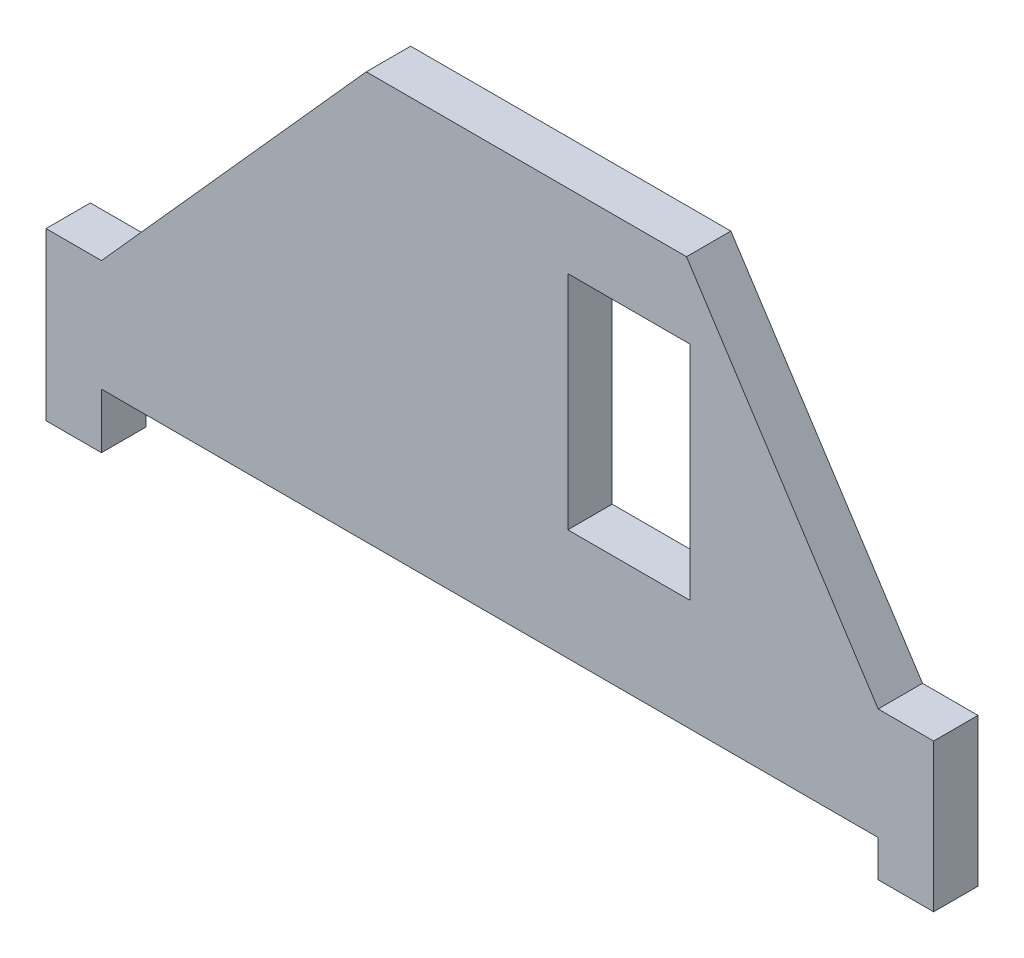
ISO-10303-21;
HEADER;
FILE_DESCRIPTION(('STEP AP214'),'2;1');
FILE_NAME('part.step','',(''),(''),'','','');
FILE_SCHEMA(('AUTOMOTIVE_DESIGN { 1 0 10303 214 1 1 1 1 }'));
ENDSEC;
DATA;
#1=APPLICATION_CONTEXT('core data for automotive mechanical design processes');
#2=APPLICATION_PROTOCOL_DEFINITION('international standard','automotive_design',2000,#1);
#3=PRODUCT_CONTEXT('',#1,'mechanical');
#4=PRODUCT('Part','Part','',(#3));
#5=PRODUCT_RELATED_PRODUCT_CATEGORY('part','',(#4));
#6=PRODUCT_DEFINITION_FORMATION('','',#4);
#7=PRODUCT_DEFINITION_CONTEXT('part definition',#1,'design');
#8=PRODUCT_DEFINITION('design','',#6,#7);
#9=PRODUCT_DEFINITION_SHAPE('','',#8);
#10=(LENGTH_UNIT() NAMED_UNIT(*) SI_UNIT(.MILLI.,.METRE.));
#11=(NAMED_UNIT(*) PLANE_ANGLE_UNIT() SI_UNIT($,.RADIAN.));
#12=(NAMED_UNIT(*) SI_UNIT($,.STERADIAN.) SOLID_ANGLE_UNIT());
#13=UNCERTAINTY_MEASURE_WITH_UNIT(LENGTH_MEASURE(1.E-05),#10,'distance_accuracy_value','');
#14=(GEOMETRIC_REPRESENTATION_CONTEXT(3) GLOBAL_UNCERTAINTY_ASSIGNED_CONTEXT((#13)) GLOBAL_UNIT_ASSIGNED_CONTEXT((#10,
#11,#12)) REPRESENTATION_CONTEXT('',''));
#15=CARTESIAN_POINT('',(0.,0.,0.));
#16=DIRECTION('',(0.,0.,1.));
#17=DIRECTION('',(1.,0.,0.));
#18=AXIS2_PLACEMENT_3D('',#15,#16,#17);
#19=CARTESIAN_POINT('',(65.0718101003511,42.1511119920742,101.6));
#20=DIRECTION('',(-0.839300486720766,-0.543667814929563,0.));
#21=DIRECTION('',(0.543667814929563,-0.839300486720766,0.));
#22=AXIS2_PLACEMENT_3D('',#19,#20,#21);
#23=PLANE('',#22);
#24=DIRECTION('',(-0.543667814929563,0.839300486720766,0.));
#25=VECTOR('',#24,1.);
#26=CARTESIAN_POINT('',(65.0718101003511,42.1511119920742,0.));
#27=LINE('',#26,#25);
#28=CARTESIAN_POINT('',(-127.,338.666666666667,0.));
#29=VERTEX_POINT('',#28);
#30=CARTESIAN_POINT('',(-565.751483096429,1016.,0.));
#31=VERTEX_POINT('',#30);
#32=EDGE_CURVE('E195',#29,#31,#27,.T.);
#33=ORIENTED_EDGE('',*,*,#32,.T.);
#34=DIRECTION('',(0.,0.,-1.));
#35=VECTOR('',#34,1.);
#36=CARTESIAN_POINT('',(-565.751483096429,1016.,101.6));
#37=LINE('',#36,#35);
#38=CARTESIAN_POINT('',(-565.751483096429,1016.,101.6));
#39=VERTEX_POINT('',#38);
#40=EDGE_CURVE('E11',#39,#31,#37,.T.);
#41=ORIENTED_EDGE('',*,*,#40,.F.);
#42=DIRECTION('',(-0.543667814929563,0.839300486720766,0.));
#43=VECTOR('',#42,1.);
#44=CARTESIAN_POINT('',(65.0718101003511,42.1511119920742,101.6));
#45=LINE('',#44,#43);
#46=CARTESIAN_POINT('',(-127.,338.666666666667,101.6));
#47=VERTEX_POINT('',#46);
#48=EDGE_CURVE('E331',#47,#39,#45,.T.);
#49=ORIENTED_EDGE('',*,*,#48,.F.);
#50=DIRECTION('',(0.,0.,-1.));
#51=VECTOR('',#50,1.);
#52=CARTESIAN_POINT('',(-127.,338.666666666667,101.6));
#53=LINE('',#52,#51);
#54=EDGE_CURVE('E53',#47,#29,#53,.T.);
#55=ORIENTED_EDGE('',*,*,#54,.T.);
#56=EDGE_LOOP('',(#33,#41,#49,#55));
#57=FACE_BOUND('',#56,.T.);
#58=ADVANCED_FACE('F34',(#57),#23,.F.);
#59=CARTESIAN_POINT('',(0.,1016.,101.6));
#60=DIRECTION('',(0.,-1.,0.));
#61=DIRECTION('',(0.,0.,-1.));
#62=AXIS2_PLACEMENT_3D('',#59,#60,#61);
#63=PLANE('',#62);
#64=DIRECTION('',(-1.,0.,0.));
#65=VECTOR('',#64,1.);
#66=CARTESIAN_POINT('',(0.,1016.,0.));
#67=LINE('',#66,#65);
#68=CARTESIAN_POINT('',(-1298.87078743548,1016.,0.));
#69=VERTEX_POINT('',#68);
#70=EDGE_CURVE('E197',#31,#69,#67,.T.);
#71=ORIENTED_EDGE('',*,*,#70,.T.);
#72=DIRECTION('',(0.,0.,-1.));
#73=VECTOR('',#72,1.);
#74=CARTESIAN_POINT('',(-1298.87078743548,1016.,101.6));
#75=LINE('',#74,#73);
#76=CARTESIAN_POINT('',(-1298.87078743548,1016.,101.6));
#77=VERTEX_POINT('',#76);
#78=EDGE_CURVE('E44',#77,#69,#75,.T.);
#79=ORIENTED_EDGE('',*,*,#78,.F.);
#80=DIRECTION('',(-1.,0.,0.));
#81=VECTOR('',#80,1.);
#82=CARTESIAN_POINT('',(0.,1016.,101.6));
#83=LINE('',#82,#81);
#84=EDGE_CURVE('E333',#39,#77,#83,.T.);
#85=ORIENTED_EDGE('',*,*,#84,.F.);
#86=ORIENTED_EDGE('',*,*,#40,.T.);
#87=EDGE_LOOP('',(#71,#79,#85,#86));
#88=FACE_BOUND('',#87,.T.);
#89=ADVANCED_FACE('F277',(#88),#63,.F.);
#90=CARTESIAN_POINT('',(-1226.15575619586,1097.25712054791,101.6));
#91=DIRECTION('',(0.745189852710884,-0.666852370031577,0.));
#92=DIRECTION('',(0.666852370031577,0.745189852710884,0.));
#93=AXIS2_PLACEMENT_3D('',#90,#91,#92);
#94=PLANE('',#93);
#95=DIRECTION('',(-0.666852370031577,-0.745189852710884,0.));
#96=VECTOR('',#95,1.);
#97=CARTESIAN_POINT('',(-1226.15575619586,1097.25712054791,0.));
#98=LINE('',#97,#96);
#99=CARTESIAN_POINT('',(-1905.,338.666666666667,0.));
#100=VERTEX_POINT('',#99);
#101=EDGE_CURVE('E199',#69,#100,#98,.T.);
#102=ORIENTED_EDGE('',*,*,#101,.T.);
#103=DIRECTION('',(0.,0.,-1.));
#104=VECTOR('',#103,1.);
#105=CARTESIAN_POINT('',(-1905.,338.666666666667,101.6));
#106=LINE('',#105,#104);
#107=CARTESIAN_POINT('',(-1905.,338.666666666667,101.6));
#108=VERTEX_POINT('',#107);
#109=EDGE_CURVE('E239',#108,#100,#106,.T.);
#110=ORIENTED_EDGE('',*,*,#109,.F.);
#111=DIRECTION('',(-0.666852370031577,-0.745189852710884,0.));
#112=VECTOR('',#111,1.);
#113=CARTESIAN_POINT('',(-1226.15575619586,1097.25712054791,101.6));
#114=LINE('',#113,#112);
#115=EDGE_CURVE('E335',#77,#108,#114,.T.);
#116=ORIENTED_EDGE('',*,*,#115,.F.);
#117=ORIENTED_EDGE('',*,*,#78,.T.);
#118=EDGE_LOOP('',(#102,#110,#116,#117));
#119=FACE_BOUND('',#118,.T.);
#120=ADVANCED_FACE('F282',(#119),#94,.F.);
#121=CARTESIAN_POINT('',(0.,338.666666666667,101.6));
#122=DIRECTION('',(0.,-1.,0.));
#123=DIRECTION('',(0.,0.,-1.));
#124=AXIS2_PLACEMENT_3D('',#121,#122,#123);
#125=PLANE('',#124);
#126=DIRECTION('',(-1.,0.,0.));
#127=VECTOR('',#126,1.);
#128=CARTESIAN_POINT('',(0.,338.666666666667,0.));
#129=LINE('',#128,#127);
#130=CARTESIAN_POINT('',(-2032.,338.666666666667,0.));
#131=VERTEX_POINT('',#130);
#132=EDGE_CURVE('E201',#100,#131,#129,.T.);
#133=ORIENTED_EDGE('',*,*,#132,.T.);
#134=DIRECTION('',(0.,0.,-1.));
#135=VECTOR('',#134,1.);
#136=CARTESIAN_POINT('',(-2032.,338.666666666667,101.6));
#137=LINE('',#136,#135);
#138=CARTESIAN_POINT('',(-2032.,338.666666666667,101.6));
#139=VERTEX_POINT('',#138);
#140=EDGE_CURVE('E237',#139,#131,#137,.T.);
#141=ORIENTED_EDGE('',*,*,#140,.F.);
#142=DIRECTION('',(-1.,0.,0.));
#143=VECTOR('',#142,1.);
#144=CARTESIAN_POINT('',(0.,338.666666666667,101.6));
#145=LINE('',#144,#143);
#146=EDGE_CURVE('E337',#108,#139,#145,.T.);
#147=ORIENTED_EDGE('',*,*,#146,.F.);
#148=ORIENTED_EDGE('',*,*,#109,.T.);
#149=EDGE_LOOP('',(#133,#141,#147,#148));
#150=FACE_BOUND('',#149,.T.);
#151=ADVANCED_FACE('F288',(#150),#125,.F.);
#152=CARTESIAN_POINT('',(-2032.,0.,101.6));
#153=DIRECTION('',(-1.,0.,0.));
#154=DIRECTION('',(0.,0.,1.));
#155=AXIS2_PLACEMENT_3D('',#152,#153,#154);
#156=PLANE('',#155);
#157=DIRECTION('',(0.,1.,0.));
#158=VECTOR('',#157,1.);
#159=CARTESIAN_POINT('',(-2032.,0.,0.));
#160=LINE('',#159,#158);
#161=CARTESIAN_POINT('',(-2032.,-42.3333333333333,0.));
#162=VERTEX_POINT('',#161);
#163=EDGE_CURVE('E204',#162,#131,#160,.T.);
#164=ORIENTED_EDGE('',*,*,#163,.F.);
#165=DIRECTION('',(0.,0.,-1.));
#166=VECTOR('',#165,1.);
#167=CARTESIAN_POINT('',(-2032.,-42.3333333333333,101.6));
#168=LINE('',#167,#166);
#169=CARTESIAN_POINT('',(-2032.,-42.3333333333333,101.6));
#170=VERTEX_POINT('',#169);
#171=EDGE_CURVE('E235',#170,#162,#168,.T.);
#172=ORIENTED_EDGE('',*,*,#171,.F.);
#173=DIRECTION('',(0.,1.,0.));
#174=VECTOR('',#173,1.);
#175=CARTESIAN_POINT('',(-2032.,0.,101.6));
#176=LINE('',#175,#174);
#177=EDGE_CURVE('E339',#170,#139,#176,.T.);
#178=ORIENTED_EDGE('',*,*,#177,.T.);
#179=ORIENTED_EDGE('',*,*,#140,.T.);
#180=EDGE_LOOP('',(#164,#172,#178,#179));
#181=FACE_BOUND('',#180,.T.);
#182=ADVANCED_FACE('F292',(#181),#156,.T.);
#183=CARTESIAN_POINT('',(0.,-42.3333333333333,101.6));
#184=DIRECTION('',(0.,-1.,0.));
#185=DIRECTION('',(0.,0.,-1.));
#186=AXIS2_PLACEMENT_3D('',#183,#184,#185);
#187=PLANE('',#186);
#188=DIRECTION('',(-1.,0.,0.));
#189=VECTOR('',#188,1.);
#190=CARTESIAN_POINT('',(0.,-42.3333333333333,0.));
#191=LINE('',#190,#189);
#192=CARTESIAN_POINT('',(-1905.,-42.3333333333333,0.));
#193=VERTEX_POINT('',#192);
#194=EDGE_CURVE('E207',#193,#162,#191,.T.);
#195=ORIENTED_EDGE('',*,*,#194,.F.);
#196=DIRECTION('',(0.,0.,-1.));
#197=VECTOR('',#196,1.);
#198=CARTESIAN_POINT('',(-1905.,-42.3333333333333,101.6));
#199=LINE('',#198,#197);
#200=CARTESIAN_POINT('',(-1905.,-42.3333333333333,101.6));
#201=VERTEX_POINT('',#200);
#202=EDGE_CURVE('E233',#201,#193,#199,.T.);
#203=ORIENTED_EDGE('',*,*,#202,.F.);
#204=DIRECTION('',(-1.,0.,0.));
#205=VECTOR('',#204,1.);
#206=CARTESIAN_POINT('',(0.,-42.3333333333333,101.6));
#207=LINE('',#206,#205);
#208=EDGE_CURVE('E342',#201,#170,#207,.T.);
#209=ORIENTED_EDGE('',*,*,#208,.T.);
#210=ORIENTED_EDGE('',*,*,#171,.T.);
#211=EDGE_LOOP('',(#195,#203,#209,#210));
#212=FACE_BOUND('',#211,.T.);
#213=ADVANCED_FACE('F296',(#212),#187,.T.);
#214=CARTESIAN_POINT('',(-1905.,0.,101.6));
#215=DIRECTION('',(1.,0.,0.));
#216=DIRECTION('',(0.,0.,-1.));
#217=AXIS2_PLACEMENT_3D('',#214,#215,#216);
#218=PLANE('',#217);
#219=DIRECTION('',(0.,-1.,0.));
#220=VECTOR('',#219,1.);
#221=CARTESIAN_POINT('',(-1905.,0.,0.));
#222=LINE('',#221,#220);
#223=CARTESIAN_POINT('',(-1905.,83.800178309497,0.));
#224=VERTEX_POINT('',#223);
#225=EDGE_CURVE('E210',#224,#193,#222,.T.);
#226=ORIENTED_EDGE('',*,*,#225,.F.);
#227=DIRECTION('',(0.,0.,-1.));
#228=VECTOR('',#227,1.);
#229=CARTESIAN_POINT('',(-1905.,83.800178309497,101.6));
#230=LINE('',#229,#228);
#231=CARTESIAN_POINT('',(-1905.,83.800178309497,101.6));
#232=VERTEX_POINT('',#231);
#233=EDGE_CURVE('E231',#232,#224,#230,.T.);
#234=ORIENTED_EDGE('',*,*,#233,.F.);
#235=DIRECTION('',(0.,-1.,0.));
#236=VECTOR('',#235,1.);
#237=CARTESIAN_POINT('',(-1905.,0.,101.6));
#238=LINE('',#237,#236);
#239=EDGE_CURVE('E345',#232,#201,#238,.T.);
#240=ORIENTED_EDGE('',*,*,#239,.T.);
#241=ORIENTED_EDGE('',*,*,#202,.T.);
#242=EDGE_LOOP('',(#226,#234,#240,#241));
#243=FACE_BOUND('',#242,.T.);
#244=ADVANCED_FACE('F300',(#243),#218,.T.);
#245=CARTESIAN_POINT('',(0.,83.800178309497,101.6));
#246=DIRECTION('',(0.,-1.,0.));
#247=DIRECTION('',(0.,0.,-1.));
#248=AXIS2_PLACEMENT_3D('',#245,#246,#247);
#249=PLANE('',#248);
#250=DIRECTION('',(-1.,0.,0.));
#251=VECTOR('',#250,1.);
#252=CARTESIAN_POINT('',(0.,83.800178309497,0.));
#253=LINE('',#252,#251);
#254=CARTESIAN_POINT('',(-127.,83.800178309497,0.));
#255=VERTEX_POINT('',#254);
#256=EDGE_CURVE('E213',#255,#224,#253,.T.);
#257=ORIENTED_EDGE('',*,*,#256,.F.);
#258=DIRECTION('',(0.,0.,-1.));
#259=VECTOR('',#258,1.);
#260=CARTESIAN_POINT('',(-127.,83.800178309497,101.6));
#261=LINE('',#260,#259);
#262=CARTESIAN_POINT('',(-127.,83.800178309497,101.6));
#263=VERTEX_POINT('',#262);
#264=EDGE_CURVE('E229',#263,#255,#261,.T.);
#265=ORIENTED_EDGE('',*,*,#264,.F.);
#266=DIRECTION('',(-1.,0.,0.));
#267=VECTOR('',#266,1.);
#268=CARTESIAN_POINT('',(0.,83.800178309497,101.6));
#269=LINE('',#268,#267);
#270=EDGE_CURVE('E348',#263,#232,#269,.T.);
#271=ORIENTED_EDGE('',*,*,#270,.T.);
#272=ORIENTED_EDGE('',*,*,#233,.T.);
#273=EDGE_LOOP('',(#257,#265,#271,#272));
#274=FACE_BOUND('',#273,.T.);
#275=ADVANCED_FACE('F304',(#274),#249,.T.);
#276=CARTESIAN_POINT('',(-127.,0.,101.6));
#277=DIRECTION('',(-1.,0.,0.));
#278=DIRECTION('',(0.,0.,1.));
#279=AXIS2_PLACEMENT_3D('',#276,#277,#278);
#280=PLANE('',#279);
#281=DIRECTION('',(0.,1.,0.));
#282=VECTOR('',#281,1.);
#283=CARTESIAN_POINT('',(-127.,0.,0.));
#284=LINE('',#283,#282);
#285=CARTESIAN_POINT('',(-127.,0.,0.));
#286=VERTEX_POINT('',#285);
#287=EDGE_CURVE('E216',#286,#255,#284,.T.);
#288=ORIENTED_EDGE('',*,*,#287,.F.);
#289=DIRECTION('',(0.,0.,-1.));
#290=VECTOR('',#289,1.);
#291=CARTESIAN_POINT('',(-127.,0.,101.6));
#292=LINE('',#291,#290);
#293=CARTESIAN_POINT('',(-127.,0.,101.6));
#294=VERTEX_POINT('',#293);
#295=EDGE_CURVE('E175',#294,#286,#292,.T.);
#296=ORIENTED_EDGE('',*,*,#295,.F.);
#297=DIRECTION('',(0.,1.,0.));
#298=VECTOR('',#297,1.);
#299=CARTESIAN_POINT('',(-127.,0.,101.6));
#300=LINE('',#299,#298);
#301=EDGE_CURVE('E165',#294,#263,#300,.T.);
#302=ORIENTED_EDGE('',*,*,#301,.T.);
#303=ORIENTED_EDGE('',*,*,#264,.T.);
#304=EDGE_LOOP('',(#288,#296,#302,#303));
#305=FACE_BOUND('',#304,.T.);
#306=ADVANCED_FACE('F308',(#305),#280,.T.);
#307=CARTESIAN_POINT('',(0.,0.,101.6));
#308=DIRECTION('',(0.,1.,0.));
#309=DIRECTION('',(0.,0.,1.));
#310=AXIS2_PLACEMENT_3D('',#307,#308,#309);
#311=PLANE('',#310);
#312=DIRECTION('',(1.,0.,0.));
#313=VECTOR('',#312,1.);
#314=CARTESIAN_POINT('',(0.,0.,0.));
#315=LINE('',#314,#313);
#316=CARTESIAN_POINT('',(0.,0.,0.));
#317=VERTEX_POINT('',#316);
#318=EDGE_CURVE('E172',#286,#317,#315,.T.);
#319=ORIENTED_EDGE('',*,*,#318,.T.);
#320=DIRECTION('',(0.,0.,-1.));
#321=VECTOR('',#320,1.);
#322=CARTESIAN_POINT('',(0.,0.,101.6));
#323=LINE('',#322,#321);
#324=CARTESIAN_POINT('',(0.,0.,101.6));
#325=VERTEX_POINT('',#324);
#326=EDGE_CURVE('E169',#325,#317,#323,.T.);
#327=ORIENTED_EDGE('',*,*,#326,.F.);
#328=DIRECTION('',(1.,0.,0.));
#329=VECTOR('',#328,1.);
#330=CARTESIAN_POINT('',(0.,0.,101.6));
#331=LINE('',#330,#329);
#332=EDGE_CURVE('E156',#294,#325,#331,.T.);
#333=ORIENTED_EDGE('',*,*,#332,.F.);
#334=ORIENTED_EDGE('',*,*,#295,.T.);
#335=EDGE_LOOP('',(#319,#327,#333,#334));
#336=FACE_BOUND('',#335,.T.);
#337=ADVANCED_FACE('F170',(#336),#311,.F.);
#338=CARTESIAN_POINT('',(0.,0.,101.6));
#339=DIRECTION('',(-1.,0.,0.));
#340=DIRECTION('',(0.,0.,1.));
#341=AXIS2_PLACEMENT_3D('',#338,#339,#340);
#342=PLANE('',#341);
#343=DIRECTION('',(0.,1.,0.));
#344=VECTOR('',#343,1.);
#345=CARTESIAN_POINT('',(0.,0.,0.));
#346=LINE('',#345,#344);
#347=CARTESIAN_POINT('',(0.,338.666666666667,0.));
#348=VERTEX_POINT('',#347);
#349=EDGE_CURVE('E220',#317,#348,#346,.T.);
#350=ORIENTED_EDGE('',*,*,#349,.T.);
#351=DIRECTION('',(0.,0.,-1.));
#352=VECTOR('',#351,1.);
#353=CARTESIAN_POINT('',(0.,338.666666666667,101.6));
#354=LINE('',#353,#352);
#355=CARTESIAN_POINT('',(0.,338.666666666667,101.6));
#356=VERTEX_POINT('',#355);
#357=EDGE_CURVE('E104',#356,#348,#354,.T.);
#358=ORIENTED_EDGE('',*,*,#357,.F.);
#359=DIRECTION('',(0.,1.,0.));
#360=VECTOR('',#359,1.);
#361=CARTESIAN_POINT('',(0.,0.,101.6));
#362=LINE('',#361,#360);
#363=EDGE_CURVE('E162',#325,#356,#362,.T.);
#364=ORIENTED_EDGE('',*,*,#363,.F.);
#365=ORIENTED_EDGE('',*,*,#326,.T.);
#366=EDGE_LOOP('',(#350,#358,#364,#365));
#367=FACE_BOUND('',#366,.T.);
#368=ADVANCED_FACE('F177',(#367),#342,.F.);
#369=CARTESIAN_POINT('',(-558.038,0.,101.6));
#370=DIRECTION('',(-1.,0.,0.));
#371=DIRECTION('',(0.,0.,1.));
#372=AXIS2_PLACEMENT_3D('',#369,#370,#371);
#373=PLANE('',#372);
#374=DIRECTION('',(0.,1.,0.));
#375=VECTOR('',#374,1.);
#376=CARTESIAN_POINT('',(-558.038,0.,0.));
#377=LINE('',#376,#375);
#378=CARTESIAN_POINT('',(-558.038,338.666666666667,0.));
#379=VERTEX_POINT('',#378);
#380=CARTESIAN_POINT('',(-558.038,846.666666666667,0.));
#381=VERTEX_POINT('',#380);
#382=EDGE_CURVE('E184',#379,#381,#377,.T.);
#383=ORIENTED_EDGE('',*,*,#382,.F.);
#384=DIRECTION('',(0.,0.,-1.));
#385=VECTOR('',#384,1.);
#386=CARTESIAN_POINT('',(-558.038,338.666666666667,101.6));
#387=LINE('',#386,#385);
#388=CARTESIAN_POINT('',(-558.038,338.666666666667,101.6));
#389=VERTEX_POINT('',#388);
#390=EDGE_CURVE('E38',#389,#379,#387,.T.);
#391=ORIENTED_EDGE('',*,*,#390,.F.);
#392=DIRECTION('',(0.,1.,0.));
#393=VECTOR('',#392,1.);
#394=CARTESIAN_POINT('',(-558.038,0.,101.6));
#395=LINE('',#394,#393);
#396=CARTESIAN_POINT('',(-558.038,846.666666666667,101.6));
#397=VERTEX_POINT('',#396);
#398=EDGE_CURVE('E225',#389,#397,#395,.T.);
#399=ORIENTED_EDGE('',*,*,#398,.T.);
#400=DIRECTION('',(0.,0.,-1.));
#401=VECTOR('',#400,1.);
#402=CARTESIAN_POINT('',(-558.038,846.666666666667,101.6));
#403=LINE('',#402,#401);
#404=EDGE_CURVE('E180',#397,#381,#403,.T.);
#405=ORIENTED_EDGE('',*,*,#404,.T.);
#406=EDGE_LOOP('',(#383,#391,#399,#405));
#407=FACE_BOUND('',#406,.T.);
#408=ADVANCED_FACE('F36',(#407),#373,.T.);
#409=CARTESIAN_POINT('',(0.,338.666666666667,101.6));
#410=DIRECTION('',(0.,-1.,0.));
#411=DIRECTION('',(0.,0.,-1.));
#412=AXIS2_PLACEMENT_3D('',#409,#410,#411);
#413=PLANE('',#412);
#414=DIRECTION('',(-1.,0.,0.));
#415=VECTOR('',#414,1.);
#416=CARTESIAN_POINT('',(0.,338.666666666667,0.));
#417=LINE('',#416,#415);
#418=CARTESIAN_POINT('',(-837.438,338.666666666667,0.));
#419=VERTEX_POINT('',#418);
#420=EDGE_CURVE('E187',#379,#419,#417,.T.);
#421=ORIENTED_EDGE('',*,*,#420,.T.);
#422=DIRECTION('',(0.,0.,-1.));
#423=VECTOR('',#422,1.);
#424=CARTESIAN_POINT('',(-837.438,338.666666666667,101.6));
#425=LINE('',#424,#423);
#426=CARTESIAN_POINT('',(-837.438,338.666666666667,101.6));
#427=VERTEX_POINT('',#426);
#428=EDGE_CURVE('E246',#427,#419,#425,.T.);
#429=ORIENTED_EDGE('',*,*,#428,.F.);
#430=DIRECTION('',(-1.,0.,0.));
#431=VECTOR('',#430,1.);
#432=CARTESIAN_POINT('',(0.,338.666666666667,101.6));
#433=LINE('',#432,#431);
#434=EDGE_CURVE('E255',#389,#427,#433,.T.);
#435=ORIENTED_EDGE('',*,*,#434,.F.);
#436=ORIENTED_EDGE('',*,*,#390,.T.);
#437=EDGE_LOOP('',(#421,#429,#435,#436));
#438=FACE_BOUND('',#437,.T.);
#439=ADVANCED_FACE('F254',(#438),#413,.F.);
#440=CARTESIAN_POINT('',(-837.438,0.,101.6));
#441=DIRECTION('',(-1.,0.,0.));
#442=DIRECTION('',(0.,0.,1.));
#443=AXIS2_PLACEMENT_3D('',#440,#441,#442);
#444=PLANE('',#443);
#445=DIRECTION('',(0.,1.,0.));
#446=VECTOR('',#445,1.);
#447=CARTESIAN_POINT('',(-837.438,0.,0.));
#448=LINE('',#447,#446);
#449=CARTESIAN_POINT('',(-837.438,846.666666666667,0.));
#450=VERTEX_POINT('',#449);
#451=EDGE_CURVE('E189',#419,#450,#448,.T.);
#452=ORIENTED_EDGE('',*,*,#451,.T.);
#453=DIRECTION('',(0.,0.,-1.));
#454=VECTOR('',#453,1.);
#455=CARTESIAN_POINT('',(-837.438,846.666666666667,101.6));
#456=LINE('',#455,#454);
#457=CARTESIAN_POINT('',(-837.438,846.666666666667,101.6));
#458=VERTEX_POINT('',#457);
#459=EDGE_CURVE('E245',#458,#450,#456,.T.);
#460=ORIENTED_EDGE('',*,*,#459,.F.);
#461=DIRECTION('',(0.,1.,0.));
#462=VECTOR('',#461,1.);
#463=CARTESIAN_POINT('',(-837.438,0.,101.6));
#464=LINE('',#463,#462);
#465=EDGE_CURVE('E326',#427,#458,#464,.T.);
#466=ORIENTED_EDGE('',*,*,#465,.F.);
#467=ORIENTED_EDGE('',*,*,#428,.T.);
#468=EDGE_LOOP('',(#452,#460,#466,#467));
#469=FACE_BOUND('',#468,.T.);
#470=ADVANCED_FACE('F267',(#469),#444,.F.);
#471=CARTESIAN_POINT('',(0.,846.666666666667,101.6));
#472=DIRECTION('',(0.,-1.,0.));
#473=DIRECTION('',(0.,0.,-1.));
#474=AXIS2_PLACEMENT_3D('',#471,#472,#473);
#475=PLANE('',#474);
#476=DIRECTION('',(-1.,0.,0.));
#477=VECTOR('',#476,1.);
#478=CARTESIAN_POINT('',(0.,846.666666666667,0.));
#479=LINE('',#478,#477);
#480=EDGE_CURVE('E192',#381,#450,#479,.T.);
#481=ORIENTED_EDGE('',*,*,#480,.F.);
#482=ORIENTED_EDGE('',*,*,#404,.F.);
#483=DIRECTION('',(-1.,0.,0.));
#484=VECTOR('',#483,1.);
#485=CARTESIAN_POINT('',(0.,846.666666666667,101.6));
#486=LINE('',#485,#484);
#487=EDGE_CURVE('E265',#397,#458,#486,.T.);
#488=ORIENTED_EDGE('',*,*,#487,.T.);
#489=ORIENTED_EDGE('',*,*,#459,.T.);
#490=EDGE_LOOP('',(#481,#482,#488,#489));
#491=FACE_BOUND('',#490,.T.);
#492=ADVANCED_FACE('F264',(#491),#475,.T.);
#493=CARTESIAN_POINT('',(0.,338.666666666667,101.6));
#494=DIRECTION('',(0.,1.,0.));
#495=DIRECTION('',(0.,0.,1.));
#496=AXIS2_PLACEMENT_3D('',#493,#494,#495);
#497=PLANE('',#496);
#498=DIRECTION('',(1.,0.,0.));
#499=VECTOR('',#498,1.);
#500=CARTESIAN_POINT('',(0.,338.666666666667,0.));
#501=LINE('',#500,#499);
#502=EDGE_CURVE('E222',#29,#348,#501,.T.);
#503=ORIENTED_EDGE('',*,*,#502,.F.);
#504=ORIENTED_EDGE('',*,*,#54,.F.);
#505=DIRECTION('',(1.,0.,0.));
#506=VECTOR('',#505,1.);
#507=CARTESIAN_POINT('',(0.,338.666666666667,101.6));
#508=LINE('',#507,#506);
#509=EDGE_CURVE('E178',#47,#356,#508,.T.);
#510=ORIENTED_EDGE('',*,*,#509,.T.);
#511=ORIENTED_EDGE('',*,*,#357,.T.);
#512=EDGE_LOOP('',(#503,#504,#510,#511));
#513=FACE_BOUND('',#512,.T.);
#514=ADVANCED_FACE('F274',(#513),#497,.T.);
#515=CARTESIAN_POINT('',(0.,0.,101.6));
#516=DIRECTION('',(0.,0.,1.));
#517=DIRECTION('',(1.,0.,0.));
#518=AXIS2_PLACEMENT_3D('',#515,#516,#517);
#519=PLANE('',#518);
#520=ORIENTED_EDGE('',*,*,#398,.F.);
#521=ORIENTED_EDGE('',*,*,#434,.T.);
#522=ORIENTED_EDGE('',*,*,#465,.T.);
#523=ORIENTED_EDGE('',*,*,#487,.F.);
#524=EDGE_LOOP('',(#520,#521,#522,#523));
#525=FACE_BOUND('',#524,.T.);
#526=ORIENTED_EDGE('',*,*,#48,.T.);
#527=ORIENTED_EDGE('',*,*,#84,.T.);
#528=ORIENTED_EDGE('',*,*,#115,.T.);
#529=ORIENTED_EDGE('',*,*,#146,.T.);
#530=ORIENTED_EDGE('',*,*,#177,.F.);
#531=ORIENTED_EDGE('',*,*,#208,.F.);
#532=ORIENTED_EDGE('',*,*,#239,.F.);
#533=ORIENTED_EDGE('',*,*,#270,.F.);
#534=ORIENTED_EDGE('',*,*,#301,.F.);
#535=ORIENTED_EDGE('',*,*,#332,.T.);
#536=ORIENTED_EDGE('',*,*,#363,.T.);
#537=ORIENTED_EDGE('',*,*,#509,.F.);
#538=EDGE_LOOP('',(#526,#527,#528,#529,#530,#531,#532,#533,#534,#535,#536,#537));
#539=FACE_BOUND('',#538,.T.);
#540=ADVANCED_FACE('F159',(#525,#539),#519,.T.);
#541=CARTESIAN_POINT('',(0.,0.,0.));
#542=DIRECTION('',(0.,0.,1.));
#543=DIRECTION('',(1.,0.,0.));
#544=AXIS2_PLACEMENT_3D('',#541,#542,#543);
#545=PLANE('',#544);
#546=ORIENTED_EDGE('',*,*,#382,.T.);
#547=ORIENTED_EDGE('',*,*,#480,.T.);
#548=ORIENTED_EDGE('',*,*,#451,.F.);
#549=ORIENTED_EDGE('',*,*,#420,.F.);
#550=EDGE_LOOP('',(#546,#547,#548,#549));
#551=FACE_BOUND('',#550,.T.);
#552=ORIENTED_EDGE('',*,*,#32,.F.);
#553=ORIENTED_EDGE('',*,*,#502,.T.);
#554=ORIENTED_EDGE('',*,*,#349,.F.);
#555=ORIENTED_EDGE('',*,*,#318,.F.);
#556=ORIENTED_EDGE('',*,*,#287,.T.);
#557=ORIENTED_EDGE('',*,*,#256,.T.);
#558=ORIENTED_EDGE('',*,*,#225,.T.);
#559=ORIENTED_EDGE('',*,*,#194,.T.);
#560=ORIENTED_EDGE('',*,*,#163,.T.);
#561=ORIENTED_EDGE('',*,*,#132,.F.);
#562=ORIENTED_EDGE('',*,*,#101,.F.);
#563=ORIENTED_EDGE('',*,*,#70,.F.);
#564=EDGE_LOOP('',(#552,#553,#554,#555,#556,#557,#558,#559,#560,#561,#562,#563));
#565=FACE_BOUND('',#564,.T.);
#566=ADVANCED_FACE('F258',(#551,#565),#545,.F.);
#567=CLOSED_SHELL('',(#58,#89,#120,#151,#182,#213,#244,#275,#306,#337,#368,#408,#439,#470,#492,
#514,#540,#566));
#568=MANIFOLD_SOLID_BREP('B2',#567);
#569=ADVANCED_BREP_SHAPE_REPRESENTATION('',(#18,#568),#14);
#570=SHAPE_DEFINITION_REPRESENTATION(#9,#569);
ENDSEC;
END-ISO-10303-21;
